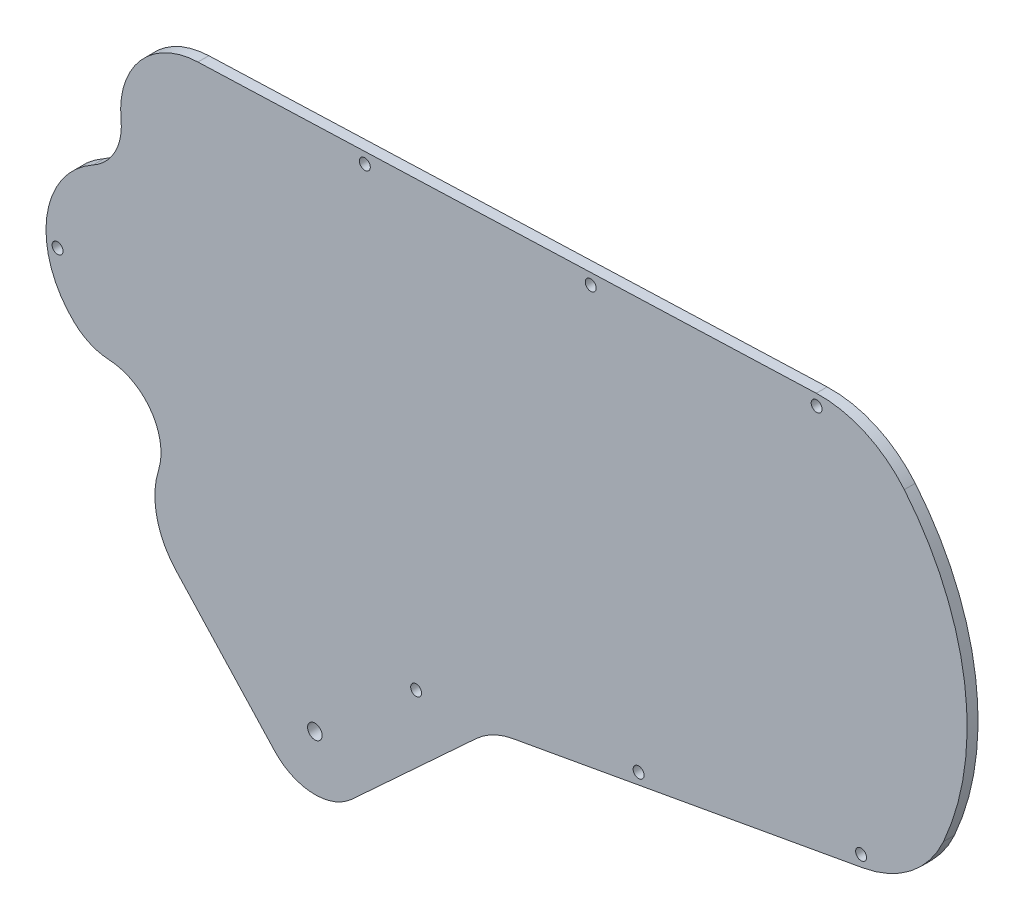
ISO-10303-21;
HEADER;
FILE_DESCRIPTION(('STEP AP214'),'2;1');
FILE_NAME('part.step','',(''),(''),'','','');
FILE_SCHEMA(('AUTOMOTIVE_DESIGN { 1 0 10303 214 1 1 1 1 }'));
ENDSEC;
DATA;
#1=APPLICATION_CONTEXT('core data for automotive mechanical design processes');
#2=APPLICATION_PROTOCOL_DEFINITION('international standard','automotive_design',2000,#1);
#3=PRODUCT_CONTEXT('',#1,'mechanical');
#4=PRODUCT('Part','Part','',(#3));
#5=PRODUCT_RELATED_PRODUCT_CATEGORY('part','',(#4));
#6=PRODUCT_DEFINITION_FORMATION('','',#4);
#7=PRODUCT_DEFINITION_CONTEXT('part definition',#1,'design');
#8=PRODUCT_DEFINITION('design','',#6,#7);
#9=PRODUCT_DEFINITION_SHAPE('','',#8);
#10=(LENGTH_UNIT() NAMED_UNIT(*) SI_UNIT(.MILLI.,.METRE.));
#11=(NAMED_UNIT(*) PLANE_ANGLE_UNIT() SI_UNIT($,.RADIAN.));
#12=(NAMED_UNIT(*) SI_UNIT($,.STERADIAN.) SOLID_ANGLE_UNIT());
#13=UNCERTAINTY_MEASURE_WITH_UNIT(LENGTH_MEASURE(1.E-05),#10,'distance_accuracy_value','');
#14=(GEOMETRIC_REPRESENTATION_CONTEXT(3) GLOBAL_UNCERTAINTY_ASSIGNED_CONTEXT((#13)) GLOBAL_UNIT_ASSIGNED_CONTEXT((#10,
#11,#12)) REPRESENTATION_CONTEXT('',''));
#15=CARTESIAN_POINT('',(0.,0.,0.));
#16=DIRECTION('',(0.,0.,1.));
#17=DIRECTION('',(1.,0.,0.));
#18=AXIS2_PLACEMENT_3D('',#15,#16,#17);
#19=CARTESIAN_POINT('',(-138.740341311309,-48.4604483125909,3.));
#20=DIRECTION('',(0.,0.,-1.));
#21=DIRECTION('',(-1.,0.,0.));
#22=AXIS2_PLACEMENT_3D('',#19,#20,#21);
#23=CYLINDRICAL_SURFACE('',#22,15.);
#24=CARTESIAN_POINT('',(-138.740341311309,-48.4604483125909,0.));
#25=DIRECTION('',(0.,0.,1.));
#26=DIRECTION('',(1.,0.,0.));
#27=AXIS2_PLACEMENT_3D('',#24,#25,#26);
#28=CIRCLE('',#27,15.);
#29=CARTESIAN_POINT('',(-124.422839539333,-52.9336063703251,0.));
#30=VERTEX_POINT('',#29);
#31=CARTESIAN_POINT('',(-137.970351553493,-33.4802241562955,0.));
#32=VERTEX_POINT('',#31);
#33=EDGE_CURVE('E180',#30,#32,#28,.T.);
#34=ORIENTED_EDGE('',*,*,#33,.F.);
#35=DIRECTION('',(0.,0.,-1.));
#36=VECTOR('',#35,1.);
#37=CARTESIAN_POINT('',(-124.422839539333,-52.9336063703251,3.));
#38=LINE('',#37,#36);
#39=CARTESIAN_POINT('',(-124.422839539333,-52.9336063703251,3.));
#40=VERTEX_POINT('',#39);
#41=EDGE_CURVE('E11',#40,#30,#38,.T.);
#42=ORIENTED_EDGE('',*,*,#41,.F.);
#43=CARTESIAN_POINT('',(-138.740341311309,-48.4604483125909,3.));
#44=DIRECTION('',(0.,0.,1.));
#45=DIRECTION('',(1.,0.,0.));
#46=AXIS2_PLACEMENT_3D('',#43,#44,#45);
#47=CIRCLE('',#46,15.);
#48=CARTESIAN_POINT('',(-137.970351553493,-33.4802241562955,3.));
#49=VERTEX_POINT('',#48);
#50=EDGE_CURVE('E218',#40,#49,#47,.T.);
#51=ORIENTED_EDGE('',*,*,#50,.T.);
#52=DIRECTION('',(0.,0.,-1.));
#53=VECTOR('',#52,1.);
#54=CARTESIAN_POINT('',(-137.970351553493,-33.4802241562955,3.));
#55=LINE('',#54,#53);
#56=EDGE_CURVE('E110',#49,#32,#55,.T.);
#57=ORIENTED_EDGE('',*,*,#56,.T.);
#58=EDGE_LOOP('',(#34,#42,#51,#57));
#59=FACE_BOUND('',#58,.T.);
#60=ADVANCED_FACE('F39',(#59),#23,.F.);
#61=CARTESIAN_POINT('',(-103.423836940436,-59.4942381883351,3.));
#62=DIRECTION('',(0.,0.,-1.));
#63=DIRECTION('',(-1.,0.,0.));
#64=AXIS2_PLACEMENT_3D('',#61,#62,#63);
#65=CYLINDRICAL_SURFACE('',#64,22.);
#66=CARTESIAN_POINT('',(-103.423836940436,-59.4942381883351,0.));
#67=DIRECTION('',(0.,0.,1.));
#68=DIRECTION('',(1.,0.,0.));
#69=AXIS2_PLACEMENT_3D('',#66,#67,#68);
#70=CIRCLE('',#69,22.);
#71=CARTESIAN_POINT('',(-119.594822483379,-74.4106461530536,0.));
#72=VERTEX_POINT('',#71);
#73=EDGE_CURVE('E183',#30,#72,#70,.T.);
#74=ORIENTED_EDGE('',*,*,#73,.T.);
#75=DIRECTION('',(0.,0.,-1.));
#76=VECTOR('',#75,1.);
#77=CARTESIAN_POINT('',(-119.594822483379,-74.4106461530536,3.));
#78=LINE('',#77,#76);
#79=CARTESIAN_POINT('',(-119.594822483379,-74.4106461530536,3.));
#80=VERTEX_POINT('',#79);
#81=EDGE_CURVE('E47',#80,#72,#78,.T.);
#82=ORIENTED_EDGE('',*,*,#81,.F.);
#83=CARTESIAN_POINT('',(-103.423836940436,-59.4942381883351,3.));
#84=DIRECTION('',(0.,0.,1.));
#85=DIRECTION('',(1.,0.,0.));
#86=AXIS2_PLACEMENT_3D('',#83,#84,#85);
#87=CIRCLE('',#86,22.);
#88=EDGE_CURVE('E315',#40,#80,#87,.T.);
#89=ORIENTED_EDGE('',*,*,#88,.F.);
#90=ORIENTED_EDGE('',*,*,#41,.T.);
#91=EDGE_LOOP('',(#74,#82,#89,#90));
#92=FACE_BOUND('',#91,.T.);
#93=ADVANCED_FACE('F308',(#92),#65,.T.);
#94=CARTESIAN_POINT('',(-101.700320400968,-93.810205025222,3.));
#95=DIRECTION('',(0.735044797406517,0.678018543850839,0.));
#96=DIRECTION('',(-0.678018543850839,0.735044797406517,0.));
#97=AXIS2_PLACEMENT_3D('',#94,#95,#96);
#98=PLANE('',#97);
#99=DIRECTION('',(0.678018543850839,-0.735044797406517,0.));
#100=VECTOR('',#99,1.);
#101=CARTESIAN_POINT('',(-101.700320400968,-93.810205025222,0.));
#102=LINE('',#101,#100);
#103=CARTESIAN_POINT('',(-92.5405177234248,-103.740413224483,0.));
#104=VERTEX_POINT('',#103);
#105=EDGE_CURVE('E186',#72,#104,#102,.T.);
#106=ORIENTED_EDGE('',*,*,#105,.T.);
#107=DIRECTION('',(0.,0.,-1.));
#108=VECTOR('',#107,1.);
#109=CARTESIAN_POINT('',(-92.5405177234248,-103.740413224483,3.));
#110=LINE('',#109,#108);
#111=CARTESIAN_POINT('',(-92.5405177234248,-103.740413224483,3.));
#112=VERTEX_POINT('',#111);
#113=EDGE_CURVE('E242',#112,#104,#110,.T.);
#114=ORIENTED_EDGE('',*,*,#113,.F.);
#115=DIRECTION('',(0.678018543850839,-0.735044797406517,0.));
#116=VECTOR('',#115,1.);
#117=CARTESIAN_POINT('',(-101.700320400968,-93.810205025222,3.));
#118=LINE('',#117,#116);
#119=EDGE_CURVE('E251',#80,#112,#118,.T.);
#120=ORIENTED_EDGE('',*,*,#119,.F.);
#121=ORIENTED_EDGE('',*,*,#81,.T.);
#122=EDGE_LOOP('',(#106,#114,#120,#121));
#123=FACE_BOUND('',#122,.T.);
#124=ADVANCED_FACE('F249',(#123),#98,.F.);
#125=CARTESIAN_POINT('',(-81.514845762327,-93.5701350667202,3.));
#126=DIRECTION('',(0.,0.,-1.));
#127=DIRECTION('',(-1.,0.,0.));
#128=AXIS2_PLACEMENT_3D('',#125,#126,#127);
#129=CYLINDRICAL_SURFACE('',#128,15.);
#130=CARTESIAN_POINT('',(-81.514845762327,-93.5701350667202,0.));
#131=DIRECTION('',(0.,0.,1.));
#132=DIRECTION('',(1.,0.,0.));
#133=AXIS2_PLACEMENT_3D('',#130,#131,#132);
#134=CIRCLE('',#133,15.);
#135=CARTESIAN_POINT('',(-71.3445676045644,-104.595807027818,0.));
#136=VERTEX_POINT('',#135);
#137=EDGE_CURVE('E188',#104,#136,#134,.T.);
#138=ORIENTED_EDGE('',*,*,#137,.T.);
#139=DIRECTION('',(0.,0.,-1.));
#140=VECTOR('',#139,1.);
#141=CARTESIAN_POINT('',(-71.3445676045644,-104.595807027818,3.));
#142=LINE('',#141,#140);
#143=CARTESIAN_POINT('',(-71.3445676045644,-104.595807027818,3.));
#144=VERTEX_POINT('',#143);
#145=EDGE_CURVE('E239',#144,#136,#142,.T.);
#146=ORIENTED_EDGE('',*,*,#145,.F.);
#147=CARTESIAN_POINT('',(-81.514845762327,-93.5701350667202,3.));
#148=DIRECTION('',(0.,0.,1.));
#149=DIRECTION('',(1.,0.,0.));
#150=AXIS2_PLACEMENT_3D('',#147,#148,#149);
#151=CIRCLE('',#150,15.);
#152=EDGE_CURVE('E271',#112,#144,#151,.T.);
#153=ORIENTED_EDGE('',*,*,#152,.F.);
#154=ORIENTED_EDGE('',*,*,#113,.T.);
#155=EDGE_LOOP('',(#138,#146,#153,#154));
#156=FACE_BOUND('',#155,.T.);
#157=ADVANCED_FACE('F261',(#156),#129,.T.);
#158=CARTESIAN_POINT('',(19.3300808353058,-20.9558801603585,3.));
#159=DIRECTION('',(-0.678018543850839,0.735044797406517,0.));
#160=DIRECTION('',(-0.735044797406517,-0.678018543850839,0.));
#161=AXIS2_PLACEMENT_3D('',#158,#159,#160);
#162=PLANE('',#161);
#163=DIRECTION('',(0.735044797406517,0.678018543850839,0.));
#164=VECTOR('',#163,1.);
#165=CARTESIAN_POINT('',(19.3300808353058,-20.9558801603585,0.));
#166=LINE('',#165,#164);
#167=CARTESIAN_POINT('',(-37.221129555645,-73.1197339248652,0.));
#168=VERTEX_POINT('',#167);
#169=EDGE_CURVE('E190',#136,#168,#166,.T.);
#170=ORIENTED_EDGE('',*,*,#169,.T.);
#171=DIRECTION('',(0.,0.,-1.));
#172=VECTOR('',#171,1.);
#173=CARTESIAN_POINT('',(-37.221129555645,-73.1197339248652,3.));
#174=LINE('',#173,#172);
#175=CARTESIAN_POINT('',(-37.221129555645,-73.1197339248652,3.));
#176=VERTEX_POINT('',#175);
#177=EDGE_CURVE('E237',#176,#168,#174,.T.);
#178=ORIENTED_EDGE('',*,*,#177,.F.);
#179=DIRECTION('',(0.735044797406517,0.678018543850839,0.));
#180=VECTOR('',#179,1.);
#181=CARTESIAN_POINT('',(19.3300808353058,-20.9558801603585,3.));
#182=LINE('',#181,#180);
#183=EDGE_CURVE('E267',#144,#176,#182,.T.);
#184=ORIENTED_EDGE('',*,*,#183,.F.);
#185=ORIENTED_EDGE('',*,*,#145,.T.);
#186=EDGE_LOOP('',(#170,#178,#184,#185));
#187=FACE_BOUND('',#186,.T.);
#188=ADVANCED_FACE('F265',(#187),#162,.F.);
#189=CARTESIAN_POINT('',(-23.5699473468777,-87.9190790932331,3.));
#190=DIRECTION('',(0.,0.,-1.));
#191=DIRECTION('',(-1.,0.,0.));
#192=AXIS2_PLACEMENT_3D('',#189,#190,#191);
#193=CYLINDRICAL_SURFACE('',#192,20.133936354063);
#194=CARTESIAN_POINT('',(-23.5699473468777,-87.9190790932331,0.));
#195=DIRECTION('',(0.,0.,1.));
#196=DIRECTION('',(1.,0.,0.));
#197=AXIS2_PLACEMENT_3D('',#194,#195,#196);
#198=CIRCLE('',#197,20.133936354063);
#199=CARTESIAN_POINT('',(-27.1400552147603,-68.1041926963561,0.));
#200=VERTEX_POINT('',#199);
#201=EDGE_CURVE('E193',#200,#168,#198,.T.);
#202=ORIENTED_EDGE('',*,*,#201,.F.);
#203=DIRECTION('',(0.,0.,-1.));
#204=VECTOR('',#203,1.);
#205=CARTESIAN_POINT('',(-27.1400552147603,-68.1041926963561,3.));
#206=LINE('',#205,#204);
#207=CARTESIAN_POINT('',(-27.1400552147603,-68.1041926963561,3.));
#208=VERTEX_POINT('',#207);
#209=EDGE_CURVE('E235',#208,#200,#206,.T.);
#210=ORIENTED_EDGE('',*,*,#209,.F.);
#211=CARTESIAN_POINT('',(-23.5699473468777,-87.9190790932331,3.));
#212=DIRECTION('',(0.,0.,1.));
#213=DIRECTION('',(1.,0.,0.));
#214=AXIS2_PLACEMENT_3D('',#211,#212,#213);
#215=CIRCLE('',#214,20.133936354063);
#216=EDGE_CURVE('E270',#208,#176,#215,.T.);
#217=ORIENTED_EDGE('',*,*,#216,.T.);
#218=ORIENTED_EDGE('',*,*,#177,.T.);
#219=EDGE_LOOP('',(#202,#210,#217,#218));
#220=FACE_BOUND('',#219,.T.);
#221=ADVANCED_FACE('F589',(#220),#193,.F.);
#222=CARTESIAN_POINT('',(11.0314039097203,-61.2267257344286,3.));
#223=DIRECTION('',(-0.177317927557775,0.98415362244246,0.));
#224=DIRECTION('',(-0.98415362244246,-0.177317927557775,0.));
#225=AXIS2_PLACEMENT_3D('',#222,#223,#224);
#226=PLANE('',#225);
#227=DIRECTION('',(0.98415362244246,0.177317927557775,0.));
#228=VECTOR('',#227,1.);
#229=CARTESIAN_POINT('',(11.0314039097203,-61.2267257344286,0.));
#230=LINE('',#229,#228);
#231=CARTESIAN_POINT('',(68.925058584331,-50.7958512941451,0.));
#232=VERTEX_POINT('',#231);
#233=EDGE_CURVE('E196',#200,#232,#230,.T.);
#234=ORIENTED_EDGE('',*,*,#233,.T.);
#235=DIRECTION('',(0.,0.,-1.));
#236=VECTOR('',#235,1.);
#237=CARTESIAN_POINT('',(68.925058584331,-50.7958512941451,3.));
#238=LINE('',#237,#236);
#239=CARTESIAN_POINT('',(68.925058584331,-50.7958512941451,3.));
#240=VERTEX_POINT('',#239);
#241=EDGE_CURVE('E232',#240,#232,#238,.T.);
#242=ORIENTED_EDGE('',*,*,#241,.F.);
#243=DIRECTION('',(0.98415362244246,0.177317927557775,0.));
#244=VECTOR('',#243,1.);
#245=CARTESIAN_POINT('',(11.0314039097203,-61.2267257344286,3.));
#246=LINE('',#245,#244);
#247=EDGE_CURVE('E273',#208,#240,#246,.T.);
#248=ORIENTED_EDGE('',*,*,#247,.F.);
#249=ORIENTED_EDGE('',*,*,#209,.T.);
#250=EDGE_LOOP('',(#234,#242,#248,#249));
#251=FACE_BOUND('',#250,.T.);
#252=ADVANCED_FACE('F580',(#251),#226,.F.);
#253=CARTESIAN_POINT('',(63.6055207575978,-21.2712426208713,3.));
#254=DIRECTION('',(0.,0.,-1.));
#255=DIRECTION('',(-1.,0.,0.));
#256=AXIS2_PLACEMENT_3D('',#253,#254,#255);
#257=CYLINDRICAL_SURFACE('',#256,30.);
#258=CARTESIAN_POINT('',(63.6055207575978,-21.2712426208713,0.));
#259=DIRECTION('',(0.,0.,1.));
#260=DIRECTION('',(1.,0.,0.));
#261=AXIS2_PLACEMENT_3D('',#258,#259,#260);
#262=CIRCLE('',#261,30.);
#263=CARTESIAN_POINT('',(91.,-33.5,0.));
#264=VERTEX_POINT('',#263);
#265=EDGE_CURVE('E198',#232,#264,#262,.T.);
#266=ORIENTED_EDGE('',*,*,#265,.T.);
#267=DIRECTION('',(0.,0.,-1.));
#268=VECTOR('',#267,1.);
#269=CARTESIAN_POINT('',(91.,-33.5,3.));
#270=LINE('',#269,#268);
#271=CARTESIAN_POINT('',(91.,-33.5,3.));
#272=VERTEX_POINT('',#271);
#273=EDGE_CURVE('E229',#272,#264,#270,.T.);
#274=ORIENTED_EDGE('',*,*,#273,.F.);
#275=CARTESIAN_POINT('',(63.6055207575978,-21.2712426208713,3.));
#276=DIRECTION('',(0.,0.,1.));
#277=DIRECTION('',(1.,0.,0.));
#278=AXIS2_PLACEMENT_3D('',#275,#276,#277);
#279=CIRCLE('',#278,30.);
#280=EDGE_CURVE('E279',#240,#272,#279,.T.);
#281=ORIENTED_EDGE('',*,*,#280,.F.);
#282=ORIENTED_EDGE('',*,*,#241,.T.);
#283=EDGE_LOOP('',(#266,#274,#281,#282));
#284=FACE_BOUND('',#283,.T.);
#285=ADVANCED_FACE('F571',(#284),#257,.T.);
#286=CARTESIAN_POINT('',(22.6589151875398,-2.99288439458776,3.));
#287=DIRECTION('',(0.,0.,-1.));
#288=DIRECTION('',(-1.,0.,0.));
#289=AXIS2_PLACEMENT_3D('',#286,#287,#288);
#290=CYLINDRICAL_SURFACE('',#289,74.8410848124602);
#291=CARTESIAN_POINT('',(22.6589151875398,-2.99288439458776,0.));
#292=DIRECTION('',(0.,0.,1.));
#293=DIRECTION('',(1.,0.,0.));
#294=AXIS2_PLACEMENT_3D('',#291,#292,#293);
#295=CIRCLE('',#294,74.8410848124602);
#296=CARTESIAN_POINT('',(80.2611947803899,44.7895952565667,0.));
#297=VERTEX_POINT('',#296);
#298=EDGE_CURVE('E200',#264,#297,#295,.T.);
#299=ORIENTED_EDGE('',*,*,#298,.T.);
#300=DIRECTION('',(0.,0.,-1.));
#301=VECTOR('',#300,1.);
#302=CARTESIAN_POINT('',(80.2611947803899,44.7895952565667,3.));
#303=LINE('',#302,#301);
#304=CARTESIAN_POINT('',(80.2611947803899,44.7895952565667,3.));
#305=VERTEX_POINT('',#304);
#306=EDGE_CURVE('E226',#305,#297,#303,.T.);
#307=ORIENTED_EDGE('',*,*,#306,.F.);
#308=CARTESIAN_POINT('',(22.6589151875398,-2.99288439458776,3.));
#309=DIRECTION('',(0.,0.,1.));
#310=DIRECTION('',(1.,0.,0.));
#311=AXIS2_PLACEMENT_3D('',#308,#309,#310);
#312=CIRCLE('',#311,74.8410848124602);
#313=EDGE_CURVE('E281',#272,#305,#312,.T.);
#314=ORIENTED_EDGE('',*,*,#313,.F.);
#315=ORIENTED_EDGE('',*,*,#273,.T.);
#316=EDGE_LOOP('',(#299,#307,#314,#315));
#317=FACE_BOUND('',#316,.T.);
#318=ADVANCED_FACE('F563',(#317),#290,.T.);
#319=CARTESIAN_POINT('',(57.1713586012944,25.6360194749397,3.));
#320=DIRECTION('',(0.,0.,-1.));
#321=DIRECTION('',(-1.,0.,0.));
#322=AXIS2_PLACEMENT_3D('',#319,#320,#321);
#323=CYLINDRICAL_SURFACE('',#322,30.);
#324=CARTESIAN_POINT('',(57.1713586012944,25.6360194749397,0.));
#325=DIRECTION('',(0.,0.,1.));
#326=DIRECTION('',(1.,0.,0.));
#327=AXIS2_PLACEMENT_3D('',#324,#325,#326);
#328=CIRCLE('',#327,30.);
#329=CARTESIAN_POINT('',(56.0882501396927,55.6164610337361,0.));
#330=VERTEX_POINT('',#329);
#331=EDGE_CURVE('E202',#297,#330,#328,.T.);
#332=ORIENTED_EDGE('',*,*,#331,.T.);
#333=DIRECTION('',(0.,0.,-1.));
#334=VECTOR('',#333,1.);
#335=CARTESIAN_POINT('',(56.0882501396927,55.6164610337361,3.));
#336=LINE('',#335,#334);
#337=CARTESIAN_POINT('',(56.0882501396927,55.6164610337361,3.));
#338=VERTEX_POINT('',#337);
#339=EDGE_CURVE('E224',#338,#330,#336,.T.);
#340=ORIENTED_EDGE('',*,*,#339,.F.);
#341=CARTESIAN_POINT('',(57.1713586012944,25.6360194749397,3.));
#342=DIRECTION('',(0.,0.,1.));
#343=DIRECTION('',(1.,0.,0.));
#344=AXIS2_PLACEMENT_3D('',#341,#342,#343);
#345=CIRCLE('',#344,30.);
#346=EDGE_CURVE('E283',#305,#338,#345,.T.);
#347=ORIENTED_EDGE('',*,*,#346,.F.);
#348=ORIENTED_EDGE('',*,*,#306,.T.);
#349=EDGE_LOOP('',(#332,#340,#347,#348));
#350=FACE_BOUND('',#349,.T.);
#351=ADVANCED_FACE('F293',(#350),#323,.T.);
#352=CARTESIAN_POINT('',(-1.93353682583297,53.5202981638076,3.));
#353=DIRECTION('',(-0.0361036153867234,0.99934805195988,0.));
#354=DIRECTION('',(-0.99934805195988,-0.0361036153867234,0.));
#355=AXIS2_PLACEMENT_3D('',#352,#353,#354);
#356=PLANE('',#355);
#357=DIRECTION('',(0.99934805195988,0.0361036153867234,0.));
#358=VECTOR('',#357,1.);
#359=CARTESIAN_POINT('',(-1.93353682583297,53.5202981638076,0.));
#360=LINE('',#359,#358);
#361=CARTESIAN_POINT('',(-113.61239782619,49.4856571431173,0.));
#362=VERTEX_POINT('',#361);
#363=EDGE_CURVE('E205',#362,#330,#360,.T.);
#364=ORIENTED_EDGE('',*,*,#363,.F.);
#365=DIRECTION('',(0.,0.,-1.));
#366=VECTOR('',#365,1.);
#367=CARTESIAN_POINT('',(-113.61239782619,49.4856571431173,3.));
#368=LINE('',#367,#366);
#369=CARTESIAN_POINT('',(-113.61239782619,49.4856571431173,3.));
#370=VERTEX_POINT('',#369);
#371=EDGE_CURVE('E222',#370,#362,#368,.T.);
#372=ORIENTED_EDGE('',*,*,#371,.F.);
#373=DIRECTION('',(0.99934805195988,0.0361036153867234,0.));
#374=VECTOR('',#373,1.);
#375=CARTESIAN_POINT('',(-1.93353682583297,53.5202981638076,3.));
#376=LINE('',#375,#374);
#377=EDGE_CURVE('E172',#370,#338,#376,.T.);
#378=ORIENTED_EDGE('',*,*,#377,.T.);
#379=ORIENTED_EDGE('',*,*,#339,.T.);
#380=EDGE_LOOP('',(#364,#372,#378,#379));
#381=FACE_BOUND('',#380,.T.);
#382=ADVANCED_FACE('F287',(#381),#356,.T.);
#383=CARTESIAN_POINT('',(-112.818118287682,27.5,3.));
#384=DIRECTION('',(0.,0.,-1.));
#385=DIRECTION('',(-1.,0.,0.));
#386=AXIS2_PLACEMENT_3D('',#383,#384,#385);
#387=CYLINDRICAL_SURFACE('',#386,22.);
#388=CARTESIAN_POINT('',(-112.818118287682,27.5,0.));
#389=DIRECTION('',(0.,0.,1.));
#390=DIRECTION('',(1.,0.,0.));
#391=AXIS2_PLACEMENT_3D('',#388,#389,#390);
#392=CIRCLE('',#391,22.);
#393=CARTESIAN_POINT('',(-134.705774542285,25.2795262486732,0.));
#394=VERTEX_POINT('',#393);
#395=EDGE_CURVE('E208',#362,#394,#392,.T.);
#396=ORIENTED_EDGE('',*,*,#395,.T.);
#397=DIRECTION('',(0.,0.,-1.));
#398=VECTOR('',#397,1.);
#399=CARTESIAN_POINT('',(-134.705774542285,25.2795262486732,3.));
#400=LINE('',#399,#398);
#401=CARTESIAN_POINT('',(-134.705774542285,25.2795262486732,3.));
#402=VERTEX_POINT('',#401);
#403=EDGE_CURVE('E159',#402,#394,#400,.T.);
#404=ORIENTED_EDGE('',*,*,#403,.F.);
#405=CARTESIAN_POINT('',(-112.818118287682,27.5,3.));
#406=DIRECTION('',(0.,0.,1.));
#407=DIRECTION('',(1.,0.,0.));
#408=AXIS2_PLACEMENT_3D('',#405,#406,#407);
#409=CIRCLE('',#408,22.);
#410=EDGE_CURVE('E169',#370,#402,#409,.T.);
#411=ORIENTED_EDGE('',*,*,#410,.F.);
#412=ORIENTED_EDGE('',*,*,#371,.T.);
#413=EDGE_LOOP('',(#396,#404,#411,#412));
#414=FACE_BOUND('',#413,.T.);
#415=ADVANCED_FACE('F298',(#414),#387,.T.);
#416=CARTESIAN_POINT('',(-149.62917653406,23.7655668727686,3.));
#417=DIRECTION('',(0.,0.,-1.));
#418=DIRECTION('',(-1.,0.,0.));
#419=AXIS2_PLACEMENT_3D('',#416,#417,#418);
#420=CYLINDRICAL_SURFACE('',#419,15.);
#421=CARTESIAN_POINT('',(-149.62917653406,23.7655668727686,0.));
#422=DIRECTION('',(0.,0.,1.));
#423=DIRECTION('',(1.,0.,0.));
#424=AXIS2_PLACEMENT_3D('',#421,#422,#423);
#425=CIRCLE('',#424,15.);
#426=CARTESIAN_POINT('',(-142.382746132034,10.6320507240518,0.));
#427=VERTEX_POINT('',#426);
#428=EDGE_CURVE('E158',#427,#394,#425,.T.);
#429=ORIENTED_EDGE('',*,*,#428,.F.);
#430=DIRECTION('',(0.,0.,-1.));
#431=VECTOR('',#430,1.);
#432=CARTESIAN_POINT('',(-142.382746132034,10.6320507240518,3.));
#433=LINE('',#432,#431);
#434=CARTESIAN_POINT('',(-142.382746132034,10.6320507240518,3.));
#435=VERTEX_POINT('',#434);
#436=EDGE_CURVE('E152',#435,#427,#433,.T.);
#437=ORIENTED_EDGE('',*,*,#436,.F.);
#438=CARTESIAN_POINT('',(-149.62917653406,23.7655668727686,3.));
#439=DIRECTION('',(0.,0.,1.));
#440=DIRECTION('',(1.,0.,0.));
#441=AXIS2_PLACEMENT_3D('',#438,#439,#440);
#442=CIRCLE('',#441,15.);
#443=EDGE_CURVE('E156',#435,#402,#442,.T.);
#444=ORIENTED_EDGE('',*,*,#443,.T.);
#445=ORIENTED_EDGE('',*,*,#403,.T.);
#446=EDGE_LOOP('',(#429,#437,#444,#445));
#447=FACE_BOUND('',#446,.T.);
#448=ADVANCED_FACE('F154',(#447),#420,.F.);
#449=CARTESIAN_POINT('',(-130.305362128659,-11.2571428571429,3.));
#450=DIRECTION('',(0.,0.,-1.));
#451=DIRECTION('',(-1.,0.,0.));
#452=AXIS2_PLACEMENT_3D('',#449,#450,#451);
#453=CYLINDRICAL_SURFACE('',#452,25.);
#454=CARTESIAN_POINT('',(-130.305362128659,-11.2571428571429,0.));
#455=DIRECTION('',(0.,0.,1.));
#456=DIRECTION('',(1.,0.,0.));
#457=AXIS2_PLACEMENT_3D('',#454,#455,#456);
#458=CIRCLE('',#457,25.);
#459=CARTESIAN_POINT('',(-147.542861296201,-29.3642857142857,0.));
#460=VERTEX_POINT('',#459);
#461=EDGE_CURVE('E103',#427,#460,#458,.T.);
#462=ORIENTED_EDGE('',*,*,#461,.T.);
#463=DIRECTION('',(0.,0.,-1.));
#464=VECTOR('',#463,1.);
#465=CARTESIAN_POINT('',(-147.542861296201,-29.3642857142857,3.));
#466=LINE('',#465,#464);
#467=CARTESIAN_POINT('',(-147.542861296201,-29.3642857142857,3.));
#468=VERTEX_POINT('',#467);
#469=EDGE_CURVE('E160',#468,#460,#466,.T.);
#470=ORIENTED_EDGE('',*,*,#469,.F.);
#471=CARTESIAN_POINT('',(-130.305362128659,-11.2571428571429,3.));
#472=DIRECTION('',(0.,0.,1.));
#473=DIRECTION('',(1.,0.,0.));
#474=AXIS2_PLACEMENT_3D('',#471,#472,#473);
#475=CIRCLE('',#474,25.);
#476=EDGE_CURVE('E162',#435,#468,#475,.T.);
#477=ORIENTED_EDGE('',*,*,#476,.F.);
#478=ORIENTED_EDGE('',*,*,#436,.T.);
#479=EDGE_LOOP('',(#462,#470,#477,#478));
#480=FACE_BOUND('',#479,.T.);
#481=ADVANCED_FACE('F163',(#480),#453,.T.);
#482=CARTESIAN_POINT('',(-137.200361795676,-18.5,3.));
#483=DIRECTION('',(0.,0.,-1.));
#484=DIRECTION('',(-1.,0.,0.));
#485=AXIS2_PLACEMENT_3D('',#482,#483,#484);
#486=CYLINDRICAL_SURFACE('',#485,15.);
#487=CARTESIAN_POINT('',(-137.200361795676,-18.5,0.));
#488=DIRECTION('',(0.,0.,1.));
#489=DIRECTION('',(1.,0.,0.));
#490=AXIS2_PLACEMENT_3D('',#487,#488,#489);
#491=CIRCLE('',#490,15.);
#492=EDGE_CURVE('E213',#460,#32,#491,.T.);
#493=ORIENTED_EDGE('',*,*,#492,.T.);
#494=ORIENTED_EDGE('',*,*,#56,.F.);
#495=CARTESIAN_POINT('',(-137.200361795676,-18.5,3.));
#496=DIRECTION('',(0.,0.,1.));
#497=DIRECTION('',(1.,0.,0.));
#498=AXIS2_PLACEMENT_3D('',#495,#496,#497);
#499=CIRCLE('',#498,15.);
#500=EDGE_CURVE('E55',#468,#49,#499,.T.);
#501=ORIENTED_EDGE('',*,*,#500,.F.);
#502=ORIENTED_EDGE('',*,*,#469,.T.);
#503=EDGE_LOOP('',(#493,#494,#501,#502));
#504=FACE_BOUND('',#503,.T.);
#505=ADVANCED_FACE('F314',(#504),#486,.T.);
#506=CARTESIAN_POINT('',(-81.514845762327,-93.5701350667202,3.));
#507=DIRECTION('',(0.,0.,-1.));
#508=DIRECTION('',(-1.,0.,0.));
#509=AXIS2_PLACEMENT_3D('',#506,#507,#508);
#510=CYLINDRICAL_SURFACE('',#509,2.);
#511=CARTESIAN_POINT('',(-81.514845762327,-93.5701350667202,3.));
#512=DIRECTION('',(0.,0.,1.));
#513=DIRECTION('',(1.,0.,0.));
#514=AXIS2_PLACEMENT_3D('',#511,#512,#513);
#515=CIRCLE('',#514,2.);
#516=CARTESIAN_POINT('',(-79.514845762327,-93.5701350667202,3.));
#517=VERTEX_POINT('',#516);
#518=EDGE_CURVE('E177',#517,#517,#515,.T.);
#519=ORIENTED_EDGE('',*,*,#518,.T.);
#520=EDGE_LOOP('',(#519));
#521=FACE_BOUND('',#520,.T.);
#522=CARTESIAN_POINT('',(-81.514845762327,-93.5701350667202,0.));
#523=DIRECTION('',(0.,0.,1.));
#524=DIRECTION('',(1.,0.,0.));
#525=AXIS2_PLACEMENT_3D('',#522,#523,#524);
#526=CIRCLE('',#525,2.);
#527=CARTESIAN_POINT('',(-79.514845762327,-93.5701350667202,0.));
#528=VERTEX_POINT('',#527);
#529=EDGE_CURVE('E215',#528,#528,#526,.T.);
#530=ORIENTED_EDGE('',*,*,#529,.F.);
#531=EDGE_LOOP('',(#530));
#532=FACE_BOUND('',#531,.T.);
#533=ADVANCED_FACE('F372',(#521,#532),#510,.F.);
#534=CARTESIAN_POINT('',(0.,0.,3.));
#535=DIRECTION('',(0.,0.,1.));
#536=DIRECTION('',(1.,0.,0.));
#537=AXIS2_PLACEMENT_3D('',#534,#535,#536);
#538=PLANE('',#537);
#539=CARTESIAN_POINT('',(-152.13370917313,-14.,3.));
#540=DIRECTION('',(0.,0.,1.));
#541=DIRECTION('',(1.,0.,0.));
#542=AXIS2_PLACEMENT_3D('',#539,#540,#541);
#543=CIRCLE('',#542,1.5);
#544=CARTESIAN_POINT('',(-150.63370917313,-14.,3.));
#545=VERTEX_POINT('',#544);
#546=EDGE_CURVE('E344',#545,#545,#543,.T.);
#547=ORIENTED_EDGE('',*,*,#546,.F.);
#548=EDGE_LOOP('',(#547));
#549=FACE_BOUND('',#548,.T.);
#550=CARTESIAN_POINT('',(-5.80343901414717,50.3785324356074,3.));
#551=DIRECTION('',(0.,0.,1.));
#552=DIRECTION('',(1.,0.,0.));
#553=AXIS2_PLACEMENT_3D('',#550,#551,#552);
#554=CIRCLE('',#553,1.5);
#555=CARTESIAN_POINT('',(-4.30343901414717,50.3785324356074,3.));
#556=VERTEX_POINT('',#555);
#557=EDGE_CURVE('E345',#556,#556,#554,.T.);
#558=ORIENTED_EDGE('',*,*,#557,.F.);
#559=EDGE_LOOP('',(#558));
#560=FACE_BOUND('',#559,.T.);
#561=CARTESIAN_POINT('',(-53.7215567955054,-69.8451574528737,3.));
#562=DIRECTION('',(0.,0.,1.));
#563=DIRECTION('',(1.,0.,0.));
#564=AXIS2_PLACEMENT_3D('',#561,#562,#563);
#565=CIRCLE('',#564,1.5);
#566=CARTESIAN_POINT('',(-52.2215567955055,-69.8451574528737,3.));
#567=VERTEX_POINT('',#566);
#568=EDGE_CURVE('E351',#567,#567,#565,.T.);
#569=ORIENTED_EDGE('',*,*,#568,.F.);
#570=EDGE_LOOP('',(#569));
#571=FACE_BOUND('',#570,.T.);
#572=CARTESIAN_POINT('',(7.33577400307612,-58.8442739398457,3.));
#573=DIRECTION('',(0.,0.,1.));
#574=DIRECTION('',(1.,0.,0.));
#575=AXIS2_PLACEMENT_3D('',#572,#573,#574);
#576=CIRCLE('',#575,1.5);
#577=CARTESIAN_POINT('',(8.83577400307613,-58.8442739398457,3.));
#578=VERTEX_POINT('',#577);
#579=EDGE_CURVE('E319',#578,#578,#576,.T.);
#580=ORIENTED_EDGE('',*,*,#579,.F.);
#581=EDGE_LOOP('',(#580));
#582=FACE_BOUND('',#581,.T.);
#583=CARTESIAN_POINT('',(68.3931048016577,-47.8433904268177,3.));
#584=DIRECTION('',(0.,0.,1.));
#585=DIRECTION('',(1.,0.,0.));
#586=AXIS2_PLACEMENT_3D('',#583,#584,#585);
#587=CIRCLE('',#586,1.5);
#588=CARTESIAN_POINT('',(69.8931048016577,-47.8433904268177,3.));
#589=VERTEX_POINT('',#588);
#590=EDGE_CURVE('E326',#589,#589,#587,.T.);
#591=ORIENTED_EDGE('',*,*,#590,.F.);
#592=EDGE_LOOP('',(#591));
#593=FACE_BOUND('',#592,.T.);
#594=CARTESIAN_POINT('',(56.1965609858528,52.6184168778565,3.));
#595=DIRECTION('',(0.,0.,1.));
#596=DIRECTION('',(1.,0.,0.));
#597=AXIS2_PLACEMENT_3D('',#594,#595,#596);
#598=CIRCLE('',#597,1.50000000000003);
#599=CARTESIAN_POINT('',(57.6965609858529,52.6184168778565,3.));
#600=VERTEX_POINT('',#599);
#601=EDGE_CURVE('E332',#600,#600,#598,.T.);
#602=ORIENTED_EDGE('',*,*,#601,.F.);
#603=EDGE_LOOP('',(#602));
#604=FACE_BOUND('',#603,.T.);
#605=CARTESIAN_POINT('',(-67.8034390141472,48.1386479933583,3.));
#606=DIRECTION('',(0.,0.,1.));
#607=DIRECTION('',(1.,0.,0.));
#608=AXIS2_PLACEMENT_3D('',#605,#606,#607);
#609=CIRCLE('',#608,1.5);
#610=CARTESIAN_POINT('',(-66.3034390141472,48.1386479933583,3.));
#611=VERTEX_POINT('',#610);
#612=EDGE_CURVE('E338',#611,#611,#609,.T.);
#613=ORIENTED_EDGE('',*,*,#612,.F.);
#614=EDGE_LOOP('',(#613));
#615=FACE_BOUND('',#614,.T.);
#616=ORIENTED_EDGE('',*,*,#50,.F.);
#617=ORIENTED_EDGE('',*,*,#88,.T.);
#618=ORIENTED_EDGE('',*,*,#119,.T.);
#619=ORIENTED_EDGE('',*,*,#152,.T.);
#620=ORIENTED_EDGE('',*,*,#183,.T.);
#621=ORIENTED_EDGE('',*,*,#216,.F.);
#622=ORIENTED_EDGE('',*,*,#247,.T.);
#623=ORIENTED_EDGE('',*,*,#280,.T.);
#624=ORIENTED_EDGE('',*,*,#313,.T.);
#625=ORIENTED_EDGE('',*,*,#346,.T.);
#626=ORIENTED_EDGE('',*,*,#377,.F.);
#627=ORIENTED_EDGE('',*,*,#410,.T.);
#628=ORIENTED_EDGE('',*,*,#443,.F.);
#629=ORIENTED_EDGE('',*,*,#476,.T.);
#630=ORIENTED_EDGE('',*,*,#500,.T.);
#631=EDGE_LOOP('',(#616,#617,#618,#619,#620,#621,#622,#623,#624,#625,#626,#627,#628,#629,#630));
#632=FACE_BOUND('',#631,.T.);
#633=ORIENTED_EDGE('',*,*,#518,.F.);
#634=EDGE_LOOP('',(#633));
#635=FACE_BOUND('',#634,.T.);
#636=ADVANCED_FACE('F165',(#549,#560,#571,#582,#593,#604,#615,#632,#635),#538,.T.);
#637=CARTESIAN_POINT('',(0.,0.,0.));
#638=DIRECTION('',(0.,0.,1.));
#639=DIRECTION('',(1.,0.,0.));
#640=AXIS2_PLACEMENT_3D('',#637,#638,#639);
#641=PLANE('',#640);
#642=CARTESIAN_POINT('',(-152.13370917313,-14.,0.));
#643=DIRECTION('',(0.,0.,1.));
#644=DIRECTION('',(1.,0.,0.));
#645=AXIS2_PLACEMENT_3D('',#642,#643,#644);
#646=CIRCLE('',#645,1.5);
#647=CARTESIAN_POINT('',(-150.63370917313,-14.,0.));
#648=VERTEX_POINT('',#647);
#649=EDGE_CURVE('E184',#648,#648,#646,.T.);
#650=ORIENTED_EDGE('',*,*,#649,.T.);
#651=EDGE_LOOP('',(#650));
#652=FACE_BOUND('',#651,.T.);
#653=CARTESIAN_POINT('',(-5.80343901414717,50.3785324356074,0.));
#654=DIRECTION('',(0.,0.,1.));
#655=DIRECTION('',(1.,0.,0.));
#656=AXIS2_PLACEMENT_3D('',#653,#654,#655);
#657=CIRCLE('',#656,1.5);
#658=CARTESIAN_POINT('',(-4.30343901414717,50.3785324356074,0.));
#659=VERTEX_POINT('',#658);
#660=EDGE_CURVE('E348',#659,#659,#657,.T.);
#661=ORIENTED_EDGE('',*,*,#660,.T.);
#662=EDGE_LOOP('',(#661));
#663=FACE_BOUND('',#662,.T.);
#664=CARTESIAN_POINT('',(-53.7215567955054,-69.8451574528737,0.));
#665=DIRECTION('',(0.,0.,1.));
#666=DIRECTION('',(1.,0.,0.));
#667=AXIS2_PLACEMENT_3D('',#664,#665,#666);
#668=CIRCLE('',#667,1.5);
#669=CARTESIAN_POINT('',(-52.2215567955055,-69.8451574528737,0.));
#670=VERTEX_POINT('',#669);
#671=EDGE_CURVE('E323',#670,#670,#668,.T.);
#672=ORIENTED_EDGE('',*,*,#671,.T.);
#673=EDGE_LOOP('',(#672));
#674=FACE_BOUND('',#673,.T.);
#675=CARTESIAN_POINT('',(7.33577400307612,-58.8442739398457,0.));
#676=DIRECTION('',(0.,0.,1.));
#677=DIRECTION('',(1.,0.,0.));
#678=AXIS2_PLACEMENT_3D('',#675,#676,#677);
#679=CIRCLE('',#678,1.5);
#680=CARTESIAN_POINT('',(8.83577400307613,-58.8442739398457,0.));
#681=VERTEX_POINT('',#680);
#682=EDGE_CURVE('E322',#681,#681,#679,.T.);
#683=ORIENTED_EDGE('',*,*,#682,.T.);
#684=EDGE_LOOP('',(#683));
#685=FACE_BOUND('',#684,.T.);
#686=CARTESIAN_POINT('',(68.3931048016577,-47.8433904268177,0.));
#687=DIRECTION('',(0.,0.,1.));
#688=DIRECTION('',(1.,0.,0.));
#689=AXIS2_PLACEMENT_3D('',#686,#687,#688);
#690=CIRCLE('',#689,1.5);
#691=CARTESIAN_POINT('',(69.8931048016577,-47.8433904268177,0.));
#692=VERTEX_POINT('',#691);
#693=EDGE_CURVE('E329',#692,#692,#690,.T.);
#694=ORIENTED_EDGE('',*,*,#693,.T.);
#695=EDGE_LOOP('',(#694));
#696=FACE_BOUND('',#695,.T.);
#697=CARTESIAN_POINT('',(56.1965609858528,52.6184168778565,0.));
#698=DIRECTION('',(0.,0.,1.));
#699=DIRECTION('',(1.,0.,0.));
#700=AXIS2_PLACEMENT_3D('',#697,#698,#699);
#701=CIRCLE('',#700,1.50000000000003);
#702=CARTESIAN_POINT('',(57.6965609858529,52.6184168778565,0.));
#703=VERTEX_POINT('',#702);
#704=EDGE_CURVE('E335',#703,#703,#701,.T.);
#705=ORIENTED_EDGE('',*,*,#704,.T.);
#706=EDGE_LOOP('',(#705));
#707=FACE_BOUND('',#706,.T.);
#708=CARTESIAN_POINT('',(-67.8034390141472,48.1386479933583,0.));
#709=DIRECTION('',(0.,0.,1.));
#710=DIRECTION('',(1.,0.,0.));
#711=AXIS2_PLACEMENT_3D('',#708,#709,#710);
#712=CIRCLE('',#711,1.5);
#713=CARTESIAN_POINT('',(-66.3034390141472,48.1386479933583,0.));
#714=VERTEX_POINT('',#713);
#715=EDGE_CURVE('E341',#714,#714,#712,.T.);
#716=ORIENTED_EDGE('',*,*,#715,.T.);
#717=EDGE_LOOP('',(#716));
#718=FACE_BOUND('',#717,.T.);
#719=ORIENTED_EDGE('',*,*,#33,.T.);
#720=ORIENTED_EDGE('',*,*,#492,.F.);
#721=ORIENTED_EDGE('',*,*,#461,.F.);
#722=ORIENTED_EDGE('',*,*,#428,.T.);
#723=ORIENTED_EDGE('',*,*,#395,.F.);
#724=ORIENTED_EDGE('',*,*,#363,.T.);
#725=ORIENTED_EDGE('',*,*,#331,.F.);
#726=ORIENTED_EDGE('',*,*,#298,.F.);
#727=ORIENTED_EDGE('',*,*,#265,.F.);
#728=ORIENTED_EDGE('',*,*,#233,.F.);
#729=ORIENTED_EDGE('',*,*,#201,.T.);
#730=ORIENTED_EDGE('',*,*,#169,.F.);
#731=ORIENTED_EDGE('',*,*,#137,.F.);
#732=ORIENTED_EDGE('',*,*,#105,.F.);
#733=ORIENTED_EDGE('',*,*,#73,.F.);
#734=EDGE_LOOP('',(#719,#720,#721,#722,#723,#724,#725,#726,#727,#728,#729,#730,#731,#732,#733));
#735=FACE_BOUND('',#734,.T.);
#736=ORIENTED_EDGE('',*,*,#529,.T.);
#737=EDGE_LOOP('',(#736));
#738=FACE_BOUND('',#737,.T.);
#739=ADVANCED_FACE('F256',(#652,#663,#674,#685,#696,#707,#718,#735,#738),#641,.F.);
#740=CARTESIAN_POINT('',(-67.8034390141472,48.1386479933583,0.));
#741=DIRECTION('',(0.,0.,1.));
#742=DIRECTION('',(1.,0.,0.));
#743=AXIS2_PLACEMENT_3D('',#740,#741,#742);
#744=CYLINDRICAL_SURFACE('',#743,1.5);
#745=ORIENTED_EDGE('',*,*,#715,.F.);
#746=EDGE_LOOP('',(#745));
#747=FACE_BOUND('',#746,.T.);
#748=ORIENTED_EDGE('',*,*,#612,.T.);
#749=EDGE_LOOP('',(#748));
#750=FACE_BOUND('',#749,.T.);
#751=ADVANCED_FACE('F386',(#747,#750),#744,.F.);
#752=CARTESIAN_POINT('',(56.1965609858528,52.6184168778565,0.));
#753=DIRECTION('',(0.,0.,1.));
#754=DIRECTION('',(1.,0.,0.));
#755=AXIS2_PLACEMENT_3D('',#752,#753,#754);
#756=CYLINDRICAL_SURFACE('',#755,1.50000000000003);
#757=ORIENTED_EDGE('',*,*,#704,.F.);
#758=EDGE_LOOP('',(#757));
#759=FACE_BOUND('',#758,.T.);
#760=ORIENTED_EDGE('',*,*,#601,.T.);
#761=EDGE_LOOP('',(#760));
#762=FACE_BOUND('',#761,.T.);
#763=ADVANCED_FACE('F388',(#759,#762),#756,.F.);
#764=CARTESIAN_POINT('',(68.3931048016577,-47.8433904268177,0.));
#765=DIRECTION('',(0.,0.,1.));
#766=DIRECTION('',(1.,0.,0.));
#767=AXIS2_PLACEMENT_3D('',#764,#765,#766);
#768=CYLINDRICAL_SURFACE('',#767,1.5);
#769=ORIENTED_EDGE('',*,*,#693,.F.);
#770=EDGE_LOOP('',(#769));
#771=FACE_BOUND('',#770,.T.);
#772=ORIENTED_EDGE('',*,*,#590,.T.);
#773=EDGE_LOOP('',(#772));
#774=FACE_BOUND('',#773,.T.);
#775=ADVANCED_FACE('F395',(#771,#774),#768,.F.);
#776=CARTESIAN_POINT('',(7.33577400307612,-58.8442739398457,0.));
#777=DIRECTION('',(0.,0.,1.));
#778=DIRECTION('',(1.,0.,0.));
#779=AXIS2_PLACEMENT_3D('',#776,#777,#778);
#780=CYLINDRICAL_SURFACE('',#779,1.5);
#781=ORIENTED_EDGE('',*,*,#682,.F.);
#782=EDGE_LOOP('',(#781));
#783=FACE_BOUND('',#782,.T.);
#784=ORIENTED_EDGE('',*,*,#579,.T.);
#785=EDGE_LOOP('',(#784));
#786=FACE_BOUND('',#785,.T.);
#787=ADVANCED_FACE('F405',(#783,#786),#780,.F.);
#788=CARTESIAN_POINT('',(-53.7215567955054,-69.8451574528737,0.));
#789=DIRECTION('',(0.,0.,1.));
#790=DIRECTION('',(1.,0.,0.));
#791=AXIS2_PLACEMENT_3D('',#788,#789,#790);
#792=CYLINDRICAL_SURFACE('',#791,1.5);
#793=ORIENTED_EDGE('',*,*,#671,.F.);
#794=EDGE_LOOP('',(#793));
#795=FACE_BOUND('',#794,.T.);
#796=ORIENTED_EDGE('',*,*,#568,.T.);
#797=EDGE_LOOP('',(#796));
#798=FACE_BOUND('',#797,.T.);
#799=ADVANCED_FACE('F408',(#795,#798),#792,.F.);
#800=CARTESIAN_POINT('',(-5.80343901414717,50.3785324356074,0.));
#801=DIRECTION('',(0.,0.,1.));
#802=DIRECTION('',(1.,0.,0.));
#803=AXIS2_PLACEMENT_3D('',#800,#801,#802);
#804=CYLINDRICAL_SURFACE('',#803,1.5);
#805=ORIENTED_EDGE('',*,*,#660,.F.);
#806=EDGE_LOOP('',(#805));
#807=FACE_BOUND('',#806,.T.);
#808=ORIENTED_EDGE('',*,*,#557,.T.);
#809=EDGE_LOOP('',(#808));
#810=FACE_BOUND('',#809,.T.);
#811=ADVANCED_FACE('F366',(#807,#810),#804,.F.);
#812=CARTESIAN_POINT('',(-152.13370917313,-14.,0.));
#813=DIRECTION('',(0.,0.,1.));
#814=DIRECTION('',(1.,0.,0.));
#815=AXIS2_PLACEMENT_3D('',#812,#813,#814);
#816=CYLINDRICAL_SURFACE('',#815,1.5);
#817=ORIENTED_EDGE('',*,*,#649,.F.);
#818=EDGE_LOOP('',(#817));
#819=FACE_BOUND('',#818,.T.);
#820=ORIENTED_EDGE('',*,*,#546,.T.);
#821=EDGE_LOOP('',(#820));
#822=FACE_BOUND('',#821,.T.);
#823=ADVANCED_FACE('F363',(#819,#822),#816,.F.);
#824=CLOSED_SHELL('',(#60,#93,#124,#157,#188,#221,#252,#285,#318,#351,#382,#415,#448,#481,#505,
#533,#636,#739,#751,#763,#775,#787,#799,#811,#823));
#825=MANIFOLD_SOLID_BREP('B2',#824);
#826=ADVANCED_BREP_SHAPE_REPRESENTATION('',(#18,#825),#14);
#827=SHAPE_DEFINITION_REPRESENTATION(#9,#826);
ENDSEC;
END-ISO-10303-21;
